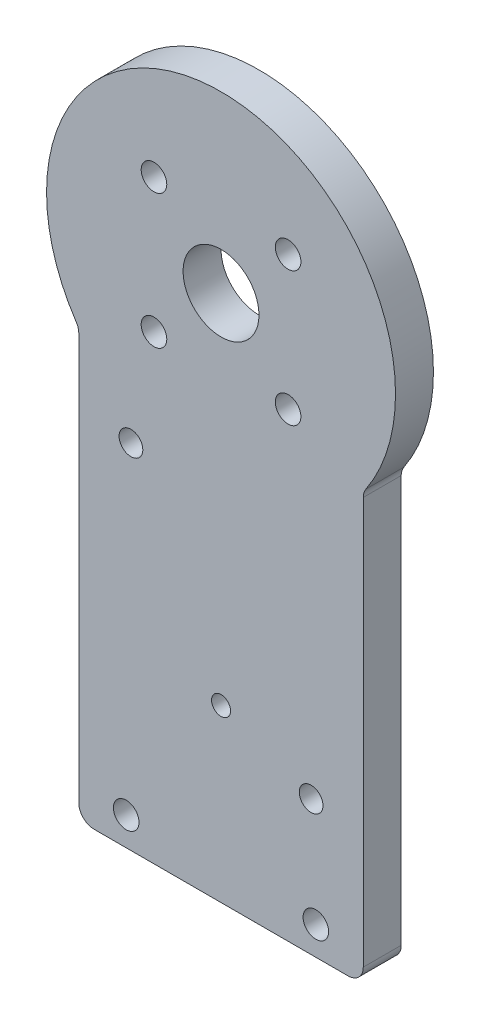
ISO-10303-21;
HEADER;
FILE_DESCRIPTION(('STEP AP214'),'2;1');
FILE_NAME('part.step','',(''),(''),'','','');
FILE_SCHEMA(('AUTOMOTIVE_DESIGN { 1 0 10303 214 1 1 1 1 }'));
ENDSEC;
DATA;
#1=APPLICATION_CONTEXT('core data for automotive mechanical design processes');
#2=APPLICATION_PROTOCOL_DEFINITION('international standard','automotive_design',2000,#1);
#3=PRODUCT_CONTEXT('',#1,'mechanical');
#4=PRODUCT('Part','Part','',(#3));
#5=PRODUCT_RELATED_PRODUCT_CATEGORY('part','',(#4));
#6=PRODUCT_DEFINITION_FORMATION('','',#4);
#7=PRODUCT_DEFINITION_CONTEXT('part definition',#1,'design');
#8=PRODUCT_DEFINITION('design','',#6,#7);
#9=PRODUCT_DEFINITION_SHAPE('','',#8);
#10=(LENGTH_UNIT() NAMED_UNIT(*) SI_UNIT(.MILLI.,.METRE.));
#11=(NAMED_UNIT(*) PLANE_ANGLE_UNIT() SI_UNIT($,.RADIAN.));
#12=(NAMED_UNIT(*) SI_UNIT($,.STERADIAN.) SOLID_ANGLE_UNIT());
#13=UNCERTAINTY_MEASURE_WITH_UNIT(LENGTH_MEASURE(1.E-05),#10,'distance_accuracy_value','');
#14=(GEOMETRIC_REPRESENTATION_CONTEXT(3) GLOBAL_UNCERTAINTY_ASSIGNED_CONTEXT((#13)) GLOBAL_UNIT_ASSIGNED_CONTEXT((#10,
#11,#12)) REPRESENTATION_CONTEXT('',''));
#15=CARTESIAN_POINT('',(0.,0.,0.));
#16=DIRECTION('',(0.,0.,1.));
#17=DIRECTION('',(1.,0.,0.));
#18=AXIS2_PLACEMENT_3D('',#15,#16,#17);
#19=CARTESIAN_POINT('',(0.,0.,4.));
#20=DIRECTION('',(0.,0.,1.));
#21=DIRECTION('',(1.,0.,0.));
#22=AXIS2_PLACEMENT_3D('',#19,#20,#21);
#23=PLANE('',#22);
#24=CARTESIAN_POINT('',(0.,-37.6564534438058,4.));
#25=DIRECTION('',(0.,0.,1.));
#26=DIRECTION('',(1.,0.,0.));
#27=AXIS2_PLACEMENT_3D('',#24,#25,#26);
#28=CIRCLE('',#27,1.);
#29=CARTESIAN_POINT('',(0.999999999999997,-37.6564534438058,4.));
#30=VERTEX_POINT('',#29);
#31=EDGE_CURVE('E343',#30,#30,#28,.T.);
#32=ORIENTED_EDGE('',*,*,#31,.F.);
#33=EDGE_LOOP('',(#32));
#34=FACE_BOUND('',#33,.T.);
#35=CARTESIAN_POINT('',(9.5,-41.434010022256,4.));
#36=DIRECTION('',(0.,0.,1.));
#37=DIRECTION('',(1.,0.,0.));
#38=AXIS2_PLACEMENT_3D('',#35,#36,#37);
#39=CIRCLE('',#38,1.25);
#40=CARTESIAN_POINT('',(10.75,-41.434010022256,4.));
#41=VERTEX_POINT('',#40);
#42=EDGE_CURVE('E354',#41,#41,#39,.T.);
#43=ORIENTED_EDGE('',*,*,#42,.F.);
#44=EDGE_LOOP('',(#43));
#45=FACE_BOUND('',#44,.T.);
#46=CARTESIAN_POINT('',(-9.99999999999999,-52.6564534438058,4.));
#47=DIRECTION('',(0.,0.,1.));
#48=DIRECTION('',(1.,0.,0.));
#49=AXIS2_PLACEMENT_3D('',#46,#47,#48);
#50=CIRCLE('',#49,1.35);
#51=CARTESIAN_POINT('',(-8.64999999999999,-52.6564534438058,4.));
#52=VERTEX_POINT('',#51);
#53=EDGE_CURVE('E366',#52,#52,#50,.T.);
#54=ORIENTED_EDGE('',*,*,#53,.F.);
#55=EDGE_LOOP('',(#54));
#56=FACE_BOUND('',#55,.T.);
#57=CARTESIAN_POINT('',(7.07106781186553,7.07106781186542,4.));
#58=DIRECTION('',(0.,0.,1.));
#59=DIRECTION('',(1.,0.,0.));
#60=AXIS2_PLACEMENT_3D('',#57,#58,#59);
#61=CIRCLE('',#60,1.35);
#62=CARTESIAN_POINT('',(8.42106781186552,7.07106781186542,4.));
#63=VERTEX_POINT('',#62);
#64=EDGE_CURVE('E378',#63,#63,#61,.T.);
#65=ORIENTED_EDGE('',*,*,#64,.F.);
#66=EDGE_LOOP('',(#65));
#67=FACE_BOUND('',#66,.T.);
#68=CARTESIAN_POINT('',(0.,0.,4.));
#69=DIRECTION('',(0.,0.,1.));
#70=DIRECTION('',(1.,0.,0.));
#71=AXIS2_PLACEMENT_3D('',#68,#69,#70);
#72=CIRCLE('',#71,4.);
#73=CARTESIAN_POINT('',(4.,0.,4.));
#74=VERTEX_POINT('',#73);
#75=EDGE_CURVE('E390',#74,#74,#72,.T.);
#76=ORIENTED_EDGE('',*,*,#75,.F.);
#77=EDGE_LOOP('',(#76));
#78=FACE_BOUND('',#77,.T.);
#79=DIRECTION('',(0.,-1.,0.));
#80=VECTOR('',#79,1.);
#81=CARTESIAN_POINT('',(-15.,-10.6564534438058,4.));
#82=LINE('',#81,#80);
#83=CARTESIAN_POINT('',(-15.,-11.1552678139075,4.));
#84=VERTEX_POINT('',#83);
#85=CARTESIAN_POINT('',(-15.,-54.0564534438058,4.));
#86=VERTEX_POINT('',#85);
#87=EDGE_CURVE('E121',#84,#86,#82,.T.);
#88=ORIENTED_EDGE('',*,*,#87,.T.);
#89=CARTESIAN_POINT('',(-13.4,-54.0564534438058,4.));
#90=DIRECTION('',(0.,0.,1.));
#91=DIRECTION('',(1.,0.,0.));
#92=AXIS2_PLACEMENT_3D('',#89,#90,#91);
#93=CIRCLE('',#92,1.6);
#94=CARTESIAN_POINT('',(-13.4,-55.6564534438058,4.));
#95=VERTEX_POINT('',#94);
#96=EDGE_CURVE('E155',#86,#95,#93,.T.);
#97=ORIENTED_EDGE('',*,*,#96,.T.);
#98=DIRECTION('',(1.,0.,0.));
#99=VECTOR('',#98,1.);
#100=CARTESIAN_POINT('',(-15.,-55.6564534438058,4.));
#101=LINE('',#100,#99);
#102=CARTESIAN_POINT('',(13.4,-55.6564534438058,4.));
#103=VERTEX_POINT('',#102);
#104=EDGE_CURVE('E172',#95,#103,#101,.T.);
#105=ORIENTED_EDGE('',*,*,#104,.T.);
#106=CARTESIAN_POINT('',(13.4,-54.0564534438058,4.));
#107=DIRECTION('',(0.,0.,1.));
#108=DIRECTION('',(1.,0.,0.));
#109=AXIS2_PLACEMENT_3D('',#106,#107,#108);
#110=CIRCLE('',#109,1.6);
#111=CARTESIAN_POINT('',(15.,-54.0564534438058,4.));
#112=VERTEX_POINT('',#111);
#113=EDGE_CURVE('E57',#103,#112,#110,.T.);
#114=ORIENTED_EDGE('',*,*,#113,.T.);
#115=DIRECTION('',(0.,1.,0.));
#116=VECTOR('',#115,1.);
#117=CARTESIAN_POINT('',(15.,-10.6564534438058,4.));
#118=LINE('',#117,#116);
#119=CARTESIAN_POINT('',(15.,-11.1552678139075,4.));
#120=VERTEX_POINT('',#119);
#121=EDGE_CURVE('E141',#112,#120,#118,.T.);
#122=ORIENTED_EDGE('',*,*,#121,.T.);
#123=CARTESIAN_POINT('',(16.6,-11.1552678139075,4.));
#124=DIRECTION('',(0.,0.,1.));
#125=DIRECTION('',(1.,0.,0.));
#126=AXIS2_PLACEMENT_3D('',#123,#124,#125);
#127=CIRCLE('',#126,1.6);
#128=CARTESIAN_POINT('',(15.272,-10.2628463887949,4.));
#129=VERTEX_POINT('',#128);
#130=EDGE_CURVE('E11',#120,#129,#127,.F.);
#131=ORIENTED_EDGE('',*,*,#130,.T.);
#132=CARTESIAN_POINT('',(0.,0.,4.));
#133=DIRECTION('',(0.,0.,1.));
#134=DIRECTION('',(1.,0.,0.));
#135=AXIS2_PLACEMENT_3D('',#132,#133,#134);
#136=CIRCLE('',#135,18.4);
#137=CARTESIAN_POINT('',(-15.272,-10.2628463887949,4.));
#138=VERTEX_POINT('',#137);
#139=EDGE_CURVE('E140',#129,#138,#136,.T.);
#140=ORIENTED_EDGE('',*,*,#139,.T.);
#141=CARTESIAN_POINT('',(-16.6,-11.1552678139075,4.));
#142=DIRECTION('',(0.,0.,1.));
#143=DIRECTION('',(1.,0.,0.));
#144=AXIS2_PLACEMENT_3D('',#141,#142,#143);
#145=CIRCLE('',#144,1.6);
#146=EDGE_CURVE('E111',#138,#84,#145,.F.);
#147=ORIENTED_EDGE('',*,*,#146,.T.);
#148=EDGE_LOOP('',(#88,#97,#105,#114,#122,#131,#140,#147));
#149=FACE_BOUND('',#148,.T.);
#150=CARTESIAN_POINT('',(-7.07106781186547,-7.07106781186547,4.));
#151=DIRECTION('',(0.,0.,1.));
#152=DIRECTION('',(1.,0.,0.));
#153=AXIS2_PLACEMENT_3D('',#150,#151,#152);
#154=CIRCLE('',#153,1.35);
#155=CARTESIAN_POINT('',(-5.72106781186547,-7.07106781186547,4.));
#156=VERTEX_POINT('',#155);
#157=EDGE_CURVE('E135',#156,#156,#154,.T.);
#158=ORIENTED_EDGE('',*,*,#157,.F.);
#159=EDGE_LOOP('',(#158));
#160=FACE_BOUND('',#159,.T.);
#161=CARTESIAN_POINT('',(-7.07106781186545,7.0710678118655,4.));
#162=DIRECTION('',(0.,0.,1.));
#163=DIRECTION('',(1.,0.,0.));
#164=AXIS2_PLACEMENT_3D('',#161,#162,#163);
#165=CIRCLE('',#164,1.35);
#166=CARTESIAN_POINT('',(-5.72106781186545,7.0710678118655,4.));
#167=VERTEX_POINT('',#166);
#168=EDGE_CURVE('E384',#167,#167,#165,.T.);
#169=ORIENTED_EDGE('',*,*,#168,.F.);
#170=EDGE_LOOP('',(#169));
#171=FACE_BOUND('',#170,.T.);
#172=CARTESIAN_POINT('',(7.0710678118654,-7.07106781186555,4.));
#173=DIRECTION('',(0.,0.,1.));
#174=DIRECTION('',(1.,0.,0.));
#175=AXIS2_PLACEMENT_3D('',#172,#173,#174);
#176=CIRCLE('',#175,1.35);
#177=CARTESIAN_POINT('',(8.4210678118654,-7.07106781186555,4.));
#178=VERTEX_POINT('',#177);
#179=EDGE_CURVE('E372',#178,#178,#176,.T.);
#180=ORIENTED_EDGE('',*,*,#179,.F.);
#181=EDGE_LOOP('',(#180));
#182=FACE_BOUND('',#181,.T.);
#183=CARTESIAN_POINT('',(10.,-52.6564534438058,4.));
#184=DIRECTION('',(0.,0.,1.));
#185=DIRECTION('',(-1.,0.,0.));
#186=AXIS2_PLACEMENT_3D('',#183,#184,#185);
#187=CIRCLE('',#186,1.35);
#188=CARTESIAN_POINT('',(8.65,-52.6564534438058,4.));
#189=VERTEX_POINT('',#188);
#190=EDGE_CURVE('E360',#189,#189,#187,.T.);
#191=ORIENTED_EDGE('',*,*,#190,.F.);
#192=EDGE_LOOP('',(#191));
#193=FACE_BOUND('',#192,.T.);
#194=CARTESIAN_POINT('',(-9.50000000000001,-18.434010022256,4.));
#195=DIRECTION('',(0.,0.,1.));
#196=DIRECTION('',(1.,0.,0.));
#197=AXIS2_PLACEMENT_3D('',#194,#195,#196);
#198=CIRCLE('',#197,1.25);
#199=CARTESIAN_POINT('',(-8.25000000000001,-18.434010022256,4.));
#200=VERTEX_POINT('',#199);
#201=EDGE_CURVE('E348',#200,#200,#198,.T.);
#202=ORIENTED_EDGE('',*,*,#201,.F.);
#203=EDGE_LOOP('',(#202));
#204=FACE_BOUND('',#203,.T.);
#205=ADVANCED_FACE('F35',(#34,#45,#56,#67,#78,#149,#160,#171,#182,#193,#204),#23,.T.);
#206=CARTESIAN_POINT('',(0.,0.,0.));
#207=DIRECTION('',(0.,0.,1.));
#208=DIRECTION('',(1.,0.,0.));
#209=AXIS2_PLACEMENT_3D('',#206,#207,#208);
#210=PLANE('',#209);
#211=CARTESIAN_POINT('',(0.,-37.6564534438058,0.));
#212=DIRECTION('',(0.,0.,1.));
#213=DIRECTION('',(1.,0.,0.));
#214=AXIS2_PLACEMENT_3D('',#211,#212,#213);
#215=CIRCLE('',#214,1.);
#216=CARTESIAN_POINT('',(0.999999999999997,-37.6564534438058,0.));
#217=VERTEX_POINT('',#216);
#218=EDGE_CURVE('E341',#217,#217,#215,.T.);
#219=ORIENTED_EDGE('',*,*,#218,.T.);
#220=EDGE_LOOP('',(#219));
#221=FACE_BOUND('',#220,.T.);
#222=DIRECTION('',(1.,0.,0.));
#223=VECTOR('',#222,1.);
#224=CARTESIAN_POINT('',(-15.,-55.6564534438058,0.));
#225=LINE('',#224,#223);
#226=CARTESIAN_POINT('',(-13.4,-55.6564534438058,0.));
#227=VERTEX_POINT('',#226);
#228=CARTESIAN_POINT('',(13.4,-55.6564534438058,0.));
#229=VERTEX_POINT('',#228);
#230=EDGE_CURVE('E129',#227,#229,#225,.T.);
#231=ORIENTED_EDGE('',*,*,#230,.F.);
#232=CARTESIAN_POINT('',(-13.4,-54.0564534438058,0.));
#233=DIRECTION('',(0.,0.,1.));
#234=DIRECTION('',(1.,0.,0.));
#235=AXIS2_PLACEMENT_3D('',#232,#233,#234);
#236=CIRCLE('',#235,1.6);
#237=CARTESIAN_POINT('',(-15.,-54.0564534438058,0.));
#238=VERTEX_POINT('',#237);
#239=EDGE_CURVE('E128',#227,#238,#236,.F.);
#240=ORIENTED_EDGE('',*,*,#239,.T.);
#241=DIRECTION('',(0.,-1.,0.));
#242=VECTOR('',#241,1.);
#243=CARTESIAN_POINT('',(-15.,-10.6564534438058,0.));
#244=LINE('',#243,#242);
#245=CARTESIAN_POINT('',(-15.,-11.1552678139075,0.));
#246=VERTEX_POINT('',#245);
#247=EDGE_CURVE('E118',#246,#238,#244,.T.);
#248=ORIENTED_EDGE('',*,*,#247,.F.);
#249=CARTESIAN_POINT('',(-16.6,-11.1552678139075,0.));
#250=DIRECTION('',(0.,0.,1.));
#251=DIRECTION('',(1.,0.,0.));
#252=AXIS2_PLACEMENT_3D('',#249,#250,#251);
#253=CIRCLE('',#252,1.6);
#254=CARTESIAN_POINT('',(-15.272,-10.2628463887949,0.));
#255=VERTEX_POINT('',#254);
#256=EDGE_CURVE('E101',#246,#255,#253,.T.);
#257=ORIENTED_EDGE('',*,*,#256,.T.);
#258=CARTESIAN_POINT('',(0.,0.,0.));
#259=DIRECTION('',(0.,0.,1.));
#260=DIRECTION('',(1.,0.,0.));
#261=AXIS2_PLACEMENT_3D('',#258,#259,#260);
#262=CIRCLE('',#261,18.4);
#263=CARTESIAN_POINT('',(15.272,-10.2628463887949,0.));
#264=VERTEX_POINT('',#263);
#265=EDGE_CURVE('E130',#264,#255,#262,.T.);
#266=ORIENTED_EDGE('',*,*,#265,.F.);
#267=CARTESIAN_POINT('',(16.6,-11.1552678139075,0.));
#268=DIRECTION('',(0.,0.,1.));
#269=DIRECTION('',(1.,0.,0.));
#270=AXIS2_PLACEMENT_3D('',#267,#268,#269);
#271=CIRCLE('',#270,1.6);
#272=CARTESIAN_POINT('',(15.,-11.1552678139075,0.));
#273=VERTEX_POINT('',#272);
#274=EDGE_CURVE('E43',#264,#273,#271,.T.);
#275=ORIENTED_EDGE('',*,*,#274,.T.);
#276=DIRECTION('',(0.,1.,0.));
#277=VECTOR('',#276,1.);
#278=CARTESIAN_POINT('',(15.,-10.6564534438058,0.));
#279=LINE('',#278,#277);
#280=CARTESIAN_POINT('',(15.,-54.0564534438058,0.));
#281=VERTEX_POINT('',#280);
#282=EDGE_CURVE('E133',#281,#273,#279,.T.);
#283=ORIENTED_EDGE('',*,*,#282,.F.);
#284=CARTESIAN_POINT('',(13.4,-54.0564534438058,0.));
#285=DIRECTION('',(0.,0.,1.));
#286=DIRECTION('',(1.,0.,0.));
#287=AXIS2_PLACEMENT_3D('',#284,#285,#286);
#288=CIRCLE('',#287,1.6);
#289=EDGE_CURVE('E151',#281,#229,#288,.F.);
#290=ORIENTED_EDGE('',*,*,#289,.T.);
#291=EDGE_LOOP('',(#231,#240,#248,#257,#266,#275,#283,#290));
#292=FACE_BOUND('',#291,.T.);
#293=CARTESIAN_POINT('',(-7.07106781186547,-7.07106781186547,0.));
#294=DIRECTION('',(0.,0.,1.));
#295=DIRECTION('',(1.,0.,0.));
#296=AXIS2_PLACEMENT_3D('',#293,#294,#295);
#297=CIRCLE('',#296,1.35);
#298=CARTESIAN_POINT('',(-5.72106781186547,-7.07106781186547,0.));
#299=VERTEX_POINT('',#298);
#300=EDGE_CURVE('E175',#299,#299,#297,.T.);
#301=ORIENTED_EDGE('',*,*,#300,.T.);
#302=EDGE_LOOP('',(#301));
#303=FACE_BOUND('',#302,.T.);
#304=CARTESIAN_POINT('',(0.,0.,0.));
#305=DIRECTION('',(0.,0.,1.));
#306=DIRECTION('',(1.,0.,0.));
#307=AXIS2_PLACEMENT_3D('',#304,#305,#306);
#308=CIRCLE('',#307,4.);
#309=CARTESIAN_POINT('',(4.,0.,0.));
#310=VERTEX_POINT('',#309);
#311=EDGE_CURVE('E387',#310,#310,#308,.T.);
#312=ORIENTED_EDGE('',*,*,#311,.T.);
#313=EDGE_LOOP('',(#312));
#314=FACE_BOUND('',#313,.T.);
#315=CARTESIAN_POINT('',(-7.07106781186545,7.0710678118655,0.));
#316=DIRECTION('',(0.,0.,1.));
#317=DIRECTION('',(1.,0.,0.));
#318=AXIS2_PLACEMENT_3D('',#315,#316,#317);
#319=CIRCLE('',#318,1.35);
#320=CARTESIAN_POINT('',(-5.72106781186545,7.0710678118655,0.));
#321=VERTEX_POINT('',#320);
#322=EDGE_CURVE('E381',#321,#321,#319,.T.);
#323=ORIENTED_EDGE('',*,*,#322,.T.);
#324=EDGE_LOOP('',(#323));
#325=FACE_BOUND('',#324,.T.);
#326=CARTESIAN_POINT('',(7.07106781186553,7.07106781186542,0.));
#327=DIRECTION('',(0.,0.,1.));
#328=DIRECTION('',(1.,0.,0.));
#329=AXIS2_PLACEMENT_3D('',#326,#327,#328);
#330=CIRCLE('',#329,1.35);
#331=CARTESIAN_POINT('',(8.42106781186552,7.07106781186542,0.));
#332=VERTEX_POINT('',#331);
#333=EDGE_CURVE('E375',#332,#332,#330,.T.);
#334=ORIENTED_EDGE('',*,*,#333,.T.);
#335=EDGE_LOOP('',(#334));
#336=FACE_BOUND('',#335,.T.);
#337=CARTESIAN_POINT('',(7.0710678118654,-7.07106781186555,0.));
#338=DIRECTION('',(0.,0.,1.));
#339=DIRECTION('',(1.,0.,0.));
#340=AXIS2_PLACEMENT_3D('',#337,#338,#339);
#341=CIRCLE('',#340,1.35);
#342=CARTESIAN_POINT('',(8.4210678118654,-7.07106781186555,0.));
#343=VERTEX_POINT('',#342);
#344=EDGE_CURVE('E369',#343,#343,#341,.T.);
#345=ORIENTED_EDGE('',*,*,#344,.T.);
#346=EDGE_LOOP('',(#345));
#347=FACE_BOUND('',#346,.T.);
#348=CARTESIAN_POINT('',(-9.99999999999999,-52.6564534438058,0.));
#349=DIRECTION('',(0.,0.,1.));
#350=DIRECTION('',(1.,0.,0.));
#351=AXIS2_PLACEMENT_3D('',#348,#349,#350);
#352=CIRCLE('',#351,1.35);
#353=CARTESIAN_POINT('',(-8.64999999999999,-52.6564534438058,0.));
#354=VERTEX_POINT('',#353);
#355=EDGE_CURVE('E363',#354,#354,#352,.T.);
#356=ORIENTED_EDGE('',*,*,#355,.T.);
#357=EDGE_LOOP('',(#356));
#358=FACE_BOUND('',#357,.T.);
#359=CARTESIAN_POINT('',(10.,-52.6564534438058,0.));
#360=DIRECTION('',(0.,0.,1.));
#361=DIRECTION('',(-1.,0.,0.));
#362=AXIS2_PLACEMENT_3D('',#359,#360,#361);
#363=CIRCLE('',#362,1.35);
#364=CARTESIAN_POINT('',(8.65,-52.6564534438058,0.));
#365=VERTEX_POINT('',#364);
#366=EDGE_CURVE('E357',#365,#365,#363,.T.);
#367=ORIENTED_EDGE('',*,*,#366,.T.);
#368=EDGE_LOOP('',(#367));
#369=FACE_BOUND('',#368,.T.);
#370=CARTESIAN_POINT('',(9.5,-41.434010022256,0.));
#371=DIRECTION('',(0.,0.,1.));
#372=DIRECTION('',(1.,0.,0.));
#373=AXIS2_PLACEMENT_3D('',#370,#371,#372);
#374=CIRCLE('',#373,1.25);
#375=CARTESIAN_POINT('',(10.75,-41.434010022256,0.));
#376=VERTEX_POINT('',#375);
#377=EDGE_CURVE('E351',#376,#376,#374,.T.);
#378=ORIENTED_EDGE('',*,*,#377,.T.);
#379=EDGE_LOOP('',(#378));
#380=FACE_BOUND('',#379,.T.);
#381=CARTESIAN_POINT('',(-9.50000000000001,-18.434010022256,0.));
#382=DIRECTION('',(0.,0.,1.));
#383=DIRECTION('',(1.,0.,0.));
#384=AXIS2_PLACEMENT_3D('',#381,#382,#383);
#385=CIRCLE('',#384,1.25);
#386=CARTESIAN_POINT('',(-8.25000000000001,-18.434010022256,0.));
#387=VERTEX_POINT('',#386);
#388=EDGE_CURVE('E345',#387,#387,#385,.T.);
#389=ORIENTED_EDGE('',*,*,#388,.T.);
#390=EDGE_LOOP('',(#389));
#391=FACE_BOUND('',#390,.T.);
#392=ADVANCED_FACE('F126',(#221,#292,#303,#314,#325,#336,#347,#358,#369,#380,#391),#210,.F.);
#393=CARTESIAN_POINT('',(0.,0.,4.));
#394=DIRECTION('',(0.,0.,-1.));
#395=DIRECTION('',(-1.,0.,0.));
#396=AXIS2_PLACEMENT_3D('',#393,#394,#395);
#397=CYLINDRICAL_SURFACE('',#396,18.4);
#398=ORIENTED_EDGE('',*,*,#265,.T.);
#399=DIRECTION('',(0.,0.,-1.));
#400=VECTOR('',#399,1.);
#401=CARTESIAN_POINT('',(-15.272,-10.2628463887949,4.));
#402=LINE('',#401,#400);
#403=EDGE_CURVE('E106',#255,#138,#402,.F.);
#404=ORIENTED_EDGE('',*,*,#403,.T.);
#405=ORIENTED_EDGE('',*,*,#139,.F.);
#406=DIRECTION('',(0.,0.,-1.));
#407=VECTOR('',#406,1.);
#408=CARTESIAN_POINT('',(15.272,-10.2628463887949,4.));
#409=LINE('',#408,#407);
#410=EDGE_CURVE('E122',#129,#264,#409,.T.);
#411=ORIENTED_EDGE('',*,*,#410,.T.);
#412=EDGE_LOOP('',(#398,#404,#405,#411));
#413=FACE_BOUND('',#412,.T.);
#414=ADVANCED_FACE('F170',(#413),#397,.T.);
#415=CARTESIAN_POINT('',(-15.,-10.6564534438058,4.));
#416=DIRECTION('',(1.,0.,0.));
#417=DIRECTION('',(0.,1.,0.));
#418=AXIS2_PLACEMENT_3D('',#415,#416,#417);
#419=PLANE('',#418);
#420=ORIENTED_EDGE('',*,*,#87,.F.);
#421=DIRECTION('',(0.,0.,1.));
#422=VECTOR('',#421,1.);
#423=CARTESIAN_POINT('',(-15.,-11.1552678139075,0.));
#424=LINE('',#423,#422);
#425=EDGE_CURVE('E105',#84,#246,#424,.F.);
#426=ORIENTED_EDGE('',*,*,#425,.T.);
#427=ORIENTED_EDGE('',*,*,#247,.T.);
#428=DIRECTION('',(0.,0.,-1.));
#429=VECTOR('',#428,1.);
#430=CARTESIAN_POINT('',(-15.,-54.0564534438058,4.));
#431=LINE('',#430,#429);
#432=EDGE_CURVE('E123',#238,#86,#431,.F.);
#433=ORIENTED_EDGE('',*,*,#432,.T.);
#434=EDGE_LOOP('',(#420,#426,#427,#433));
#435=FACE_BOUND('',#434,.T.);
#436=ADVANCED_FACE('F117',(#435),#419,.F.);
#437=CARTESIAN_POINT('',(-15.,-55.6564534438058,4.));
#438=DIRECTION('',(0.,1.,0.));
#439=DIRECTION('',(-1.,0.,0.));
#440=AXIS2_PLACEMENT_3D('',#437,#438,#439);
#441=PLANE('',#440);
#442=ORIENTED_EDGE('',*,*,#104,.F.);
#443=DIRECTION('',(0.,0.,-1.));
#444=VECTOR('',#443,1.);
#445=CARTESIAN_POINT('',(-13.4,-55.6564534438058,4.));
#446=LINE('',#445,#444);
#447=EDGE_CURVE('E148',#95,#227,#446,.T.);
#448=ORIENTED_EDGE('',*,*,#447,.T.);
#449=ORIENTED_EDGE('',*,*,#230,.T.);
#450=DIRECTION('',(0.,0.,-1.));
#451=VECTOR('',#450,1.);
#452=CARTESIAN_POINT('',(13.4,-55.6564534438058,4.));
#453=LINE('',#452,#451);
#454=EDGE_CURVE('E146',#229,#103,#453,.F.);
#455=ORIENTED_EDGE('',*,*,#454,.T.);
#456=EDGE_LOOP('',(#442,#448,#449,#455));
#457=FACE_BOUND('',#456,.T.);
#458=ADVANCED_FACE('F185',(#457),#441,.F.);
#459=CARTESIAN_POINT('',(15.,-10.6564534438058,4.));
#460=DIRECTION('',(-1.,0.,0.));
#461=DIRECTION('',(0.,-1.,0.));
#462=AXIS2_PLACEMENT_3D('',#459,#460,#461);
#463=PLANE('',#462);
#464=ORIENTED_EDGE('',*,*,#121,.F.);
#465=DIRECTION('',(0.,0.,-1.));
#466=VECTOR('',#465,1.);
#467=CARTESIAN_POINT('',(15.,-54.0564534438058,4.));
#468=LINE('',#467,#466);
#469=EDGE_CURVE('E112',#112,#281,#468,.T.);
#470=ORIENTED_EDGE('',*,*,#469,.T.);
#471=ORIENTED_EDGE('',*,*,#282,.T.);
#472=DIRECTION('',(0.,0.,1.));
#473=VECTOR('',#472,1.);
#474=CARTESIAN_POINT('',(15.,-11.1552678139075,4.));
#475=LINE('',#474,#473);
#476=EDGE_CURVE('E50',#273,#120,#475,.T.);
#477=ORIENTED_EDGE('',*,*,#476,.T.);
#478=EDGE_LOOP('',(#464,#470,#471,#477));
#479=FACE_BOUND('',#478,.T.);
#480=ADVANCED_FACE('F163',(#479),#463,.F.);
#481=CARTESIAN_POINT('',(-7.07106781186547,-7.07106781186547,4.));
#482=DIRECTION('',(0.,0.,-1.));
#483=DIRECTION('',(-1.,0.,0.));
#484=AXIS2_PLACEMENT_3D('',#481,#482,#483);
#485=CYLINDRICAL_SURFACE('',#484,1.35);
#486=ORIENTED_EDGE('',*,*,#157,.T.);
#487=EDGE_LOOP('',(#486));
#488=FACE_BOUND('',#487,.T.);
#489=ORIENTED_EDGE('',*,*,#300,.F.);
#490=EDGE_LOOP('',(#489));
#491=FACE_BOUND('',#490,.T.);
#492=ADVANCED_FACE('F208',(#488,#491),#485,.F.);
#493=CARTESIAN_POINT('',(0.,0.,4.));
#494=DIRECTION('',(0.,0.,-1.));
#495=DIRECTION('',(-1.,0.,0.));
#496=AXIS2_PLACEMENT_3D('',#493,#494,#495);
#497=CYLINDRICAL_SURFACE('',#496,4.);
#498=ORIENTED_EDGE('',*,*,#75,.T.);
#499=EDGE_LOOP('',(#498));
#500=FACE_BOUND('',#499,.T.);
#501=ORIENTED_EDGE('',*,*,#311,.F.);
#502=EDGE_LOOP('',(#501));
#503=FACE_BOUND('',#502,.T.);
#504=ADVANCED_FACE('F243',(#500,#503),#497,.F.);
#505=CARTESIAN_POINT('',(-7.07106781186545,7.0710678118655,4.));
#506=DIRECTION('',(0.,0.,-1.));
#507=DIRECTION('',(-1.,0.,0.));
#508=AXIS2_PLACEMENT_3D('',#505,#506,#507);
#509=CYLINDRICAL_SURFACE('',#508,1.35);
#510=ORIENTED_EDGE('',*,*,#168,.T.);
#511=EDGE_LOOP('',(#510));
#512=FACE_BOUND('',#511,.T.);
#513=ORIENTED_EDGE('',*,*,#322,.F.);
#514=EDGE_LOOP('',(#513));
#515=FACE_BOUND('',#514,.T.);
#516=ADVANCED_FACE('F250',(#512,#515),#509,.F.);
#517=CARTESIAN_POINT('',(7.07106781186553,7.07106781186542,4.));
#518=DIRECTION('',(0.,0.,-1.));
#519=DIRECTION('',(-1.,0.,0.));
#520=AXIS2_PLACEMENT_3D('',#517,#518,#519);
#521=CYLINDRICAL_SURFACE('',#520,1.35);
#522=ORIENTED_EDGE('',*,*,#64,.T.);
#523=EDGE_LOOP('',(#522));
#524=FACE_BOUND('',#523,.T.);
#525=ORIENTED_EDGE('',*,*,#333,.F.);
#526=EDGE_LOOP('',(#525));
#527=FACE_BOUND('',#526,.T.);
#528=ADVANCED_FACE('F257',(#524,#527),#521,.F.);
#529=CARTESIAN_POINT('',(7.0710678118654,-7.07106781186555,4.));
#530=DIRECTION('',(0.,0.,-1.));
#531=DIRECTION('',(-1.,0.,0.));
#532=AXIS2_PLACEMENT_3D('',#529,#530,#531);
#533=CYLINDRICAL_SURFACE('',#532,1.35);
#534=ORIENTED_EDGE('',*,*,#179,.T.);
#535=EDGE_LOOP('',(#534));
#536=FACE_BOUND('',#535,.T.);
#537=ORIENTED_EDGE('',*,*,#344,.F.);
#538=EDGE_LOOP('',(#537));
#539=FACE_BOUND('',#538,.T.);
#540=ADVANCED_FACE('F265',(#536,#539),#533,.F.);
#541=CARTESIAN_POINT('',(-9.99999999999999,-52.6564534438058,4.));
#542=DIRECTION('',(0.,0.,-1.));
#543=DIRECTION('',(-1.,0.,0.));
#544=AXIS2_PLACEMENT_3D('',#541,#542,#543);
#545=CYLINDRICAL_SURFACE('',#544,1.35);
#546=ORIENTED_EDGE('',*,*,#53,.T.);
#547=EDGE_LOOP('',(#546));
#548=FACE_BOUND('',#547,.T.);
#549=ORIENTED_EDGE('',*,*,#355,.F.);
#550=EDGE_LOOP('',(#549));
#551=FACE_BOUND('',#550,.T.);
#552=ADVANCED_FACE('F273',(#548,#551),#545,.F.);
#553=CARTESIAN_POINT('',(10.,-52.6564534438058,4.));
#554=DIRECTION('',(0.,0.,-1.));
#555=DIRECTION('',(-1.,0.,0.));
#556=AXIS2_PLACEMENT_3D('',#553,#554,#555);
#557=CYLINDRICAL_SURFACE('',#556,1.35);
#558=ORIENTED_EDGE('',*,*,#190,.T.);
#559=EDGE_LOOP('',(#558));
#560=FACE_BOUND('',#559,.T.);
#561=ORIENTED_EDGE('',*,*,#366,.F.);
#562=EDGE_LOOP('',(#561));
#563=FACE_BOUND('',#562,.T.);
#564=ADVANCED_FACE('F281',(#560,#563),#557,.F.);
#565=CARTESIAN_POINT('',(9.5,-41.434010022256,4.));
#566=DIRECTION('',(0.,0.,-1.));
#567=DIRECTION('',(-1.,0.,0.));
#568=AXIS2_PLACEMENT_3D('',#565,#566,#567);
#569=CYLINDRICAL_SURFACE('',#568,1.25);
#570=ORIENTED_EDGE('',*,*,#42,.T.);
#571=EDGE_LOOP('',(#570));
#572=FACE_BOUND('',#571,.T.);
#573=ORIENTED_EDGE('',*,*,#377,.F.);
#574=EDGE_LOOP('',(#573));
#575=FACE_BOUND('',#574,.T.);
#576=ADVANCED_FACE('F289',(#572,#575),#569,.F.);
#577=CARTESIAN_POINT('',(-9.50000000000001,-18.434010022256,4.));
#578=DIRECTION('',(0.,0.,-1.));
#579=DIRECTION('',(-1.,0.,0.));
#580=AXIS2_PLACEMENT_3D('',#577,#578,#579);
#581=CYLINDRICAL_SURFACE('',#580,1.25);
#582=ORIENTED_EDGE('',*,*,#201,.T.);
#583=EDGE_LOOP('',(#582));
#584=FACE_BOUND('',#583,.T.);
#585=ORIENTED_EDGE('',*,*,#388,.F.);
#586=EDGE_LOOP('',(#585));
#587=FACE_BOUND('',#586,.T.);
#588=ADVANCED_FACE('F194',(#584,#587),#581,.F.);
#589=CARTESIAN_POINT('',(-16.6,-11.1552678139075,4.));
#590=DIRECTION('',(0.,0.,-1.));
#591=DIRECTION('',(-1.,0.,0.));
#592=AXIS2_PLACEMENT_3D('',#589,#590,#591);
#593=CYLINDRICAL_SURFACE('',#592,1.6);
#594=ORIENTED_EDGE('',*,*,#146,.F.);
#595=ORIENTED_EDGE('',*,*,#403,.F.);
#596=ORIENTED_EDGE('',*,*,#256,.F.);
#597=ORIENTED_EDGE('',*,*,#425,.F.);
#598=EDGE_LOOP('',(#594,#595,#596,#597));
#599=FACE_BOUND('',#598,.T.);
#600=ADVANCED_FACE('F104',(#599),#593,.F.);
#601=CARTESIAN_POINT('',(-13.4,-54.0564534438058,4.));
#602=DIRECTION('',(0.,0.,-1.));
#603=DIRECTION('',(-1.,0.,0.));
#604=AXIS2_PLACEMENT_3D('',#601,#602,#603);
#605=CYLINDRICAL_SURFACE('',#604,1.6);
#606=ORIENTED_EDGE('',*,*,#96,.F.);
#607=ORIENTED_EDGE('',*,*,#432,.F.);
#608=ORIENTED_EDGE('',*,*,#239,.F.);
#609=ORIENTED_EDGE('',*,*,#447,.F.);
#610=EDGE_LOOP('',(#606,#607,#608,#609));
#611=FACE_BOUND('',#610,.T.);
#612=ADVANCED_FACE('F187',(#611),#605,.T.);
#613=CARTESIAN_POINT('',(13.4,-54.0564534438058,4.));
#614=DIRECTION('',(0.,0.,-1.));
#615=DIRECTION('',(-1.,0.,0.));
#616=AXIS2_PLACEMENT_3D('',#613,#614,#615);
#617=CYLINDRICAL_SURFACE('',#616,1.6);
#618=ORIENTED_EDGE('',*,*,#113,.F.);
#619=ORIENTED_EDGE('',*,*,#454,.F.);
#620=ORIENTED_EDGE('',*,*,#289,.F.);
#621=ORIENTED_EDGE('',*,*,#469,.F.);
#622=EDGE_LOOP('',(#618,#619,#620,#621));
#623=FACE_BOUND('',#622,.T.);
#624=ADVANCED_FACE('F184',(#623),#617,.T.);
#625=CARTESIAN_POINT('',(16.6,-11.1552678139075,4.));
#626=DIRECTION('',(0.,0.,-1.));
#627=DIRECTION('',(-1.,0.,0.));
#628=AXIS2_PLACEMENT_3D('',#625,#626,#627);
#629=CYLINDRICAL_SURFACE('',#628,1.6);
#630=ORIENTED_EDGE('',*,*,#130,.F.);
#631=ORIENTED_EDGE('',*,*,#476,.F.);
#632=ORIENTED_EDGE('',*,*,#274,.F.);
#633=ORIENTED_EDGE('',*,*,#410,.F.);
#634=EDGE_LOOP('',(#630,#631,#632,#633));
#635=FACE_BOUND('',#634,.T.);
#636=ADVANCED_FACE('F37',(#635),#629,.F.);
#637=CARTESIAN_POINT('',(0.,-37.6564534438058,0.));
#638=DIRECTION('',(0.,0.,1.));
#639=DIRECTION('',(1.,0.,0.));
#640=AXIS2_PLACEMENT_3D('',#637,#638,#639);
#641=CYLINDRICAL_SURFACE('',#640,1.);
#642=ORIENTED_EDGE('',*,*,#218,.F.);
#643=EDGE_LOOP('',(#642));
#644=FACE_BOUND('',#643,.T.);
#645=ORIENTED_EDGE('',*,*,#31,.T.);
#646=EDGE_LOOP('',(#645));
#647=FACE_BOUND('',#646,.T.);
#648=ADVANCED_FACE('F324',(#644,#647),#641,.F.);
#649=CLOSED_SHELL('',(#205,#392,#414,#436,#458,#480,#492,#504,#516,#528,#540,#552,#564,#576,
#588,#600,#612,#624,#636,#648));
#650=MANIFOLD_SOLID_BREP('B2',#649);
#651=ADVANCED_BREP_SHAPE_REPRESENTATION('',(#18,#650),#14);
#652=SHAPE_DEFINITION_REPRESENTATION(#9,#651);
ENDSEC;
END-ISO-10303-21;
